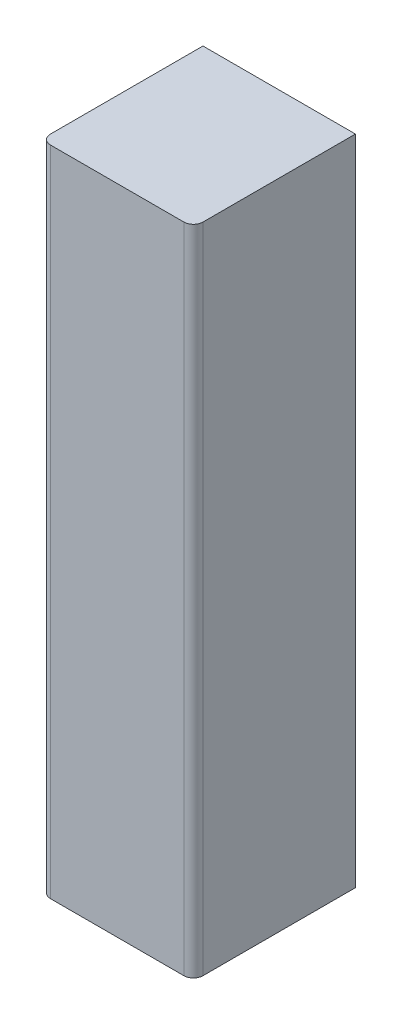
ISO-10303-21;
HEADER;
FILE_DESCRIPTION(('STEP AP214'),'2;1');
FILE_NAME('part.step','',(''),(''),'','','');
FILE_SCHEMA(('AUTOMOTIVE_DESIGN { 1 0 10303 214 1 1 1 1 }'));
ENDSEC;
DATA;
#1=APPLICATION_CONTEXT('core data for automotive mechanical design processes');
#2=APPLICATION_PROTOCOL_DEFINITION('international standard','automotive_design',2000,#1);
#3=PRODUCT_CONTEXT('',#1,'mechanical');
#4=PRODUCT('Part','Part','',(#3));
#5=PRODUCT_RELATED_PRODUCT_CATEGORY('part','',(#4));
#6=PRODUCT_DEFINITION_FORMATION('','',#4);
#7=PRODUCT_DEFINITION_CONTEXT('part definition',#1,'design');
#8=PRODUCT_DEFINITION('design','',#6,#7);
#9=PRODUCT_DEFINITION_SHAPE('','',#8);
#10=(LENGTH_UNIT() NAMED_UNIT(*) SI_UNIT(.MILLI.,.METRE.));
#11=(NAMED_UNIT(*) PLANE_ANGLE_UNIT() SI_UNIT($,.RADIAN.));
#12=(NAMED_UNIT(*) SI_UNIT($,.STERADIAN.) SOLID_ANGLE_UNIT());
#13=UNCERTAINTY_MEASURE_WITH_UNIT(LENGTH_MEASURE(1.E-05),#10,'distance_accuracy_value','');
#14=(GEOMETRIC_REPRESENTATION_CONTEXT(3) GLOBAL_UNCERTAINTY_ASSIGNED_CONTEXT((#13)) GLOBAL_UNIT_ASSIGNED_CONTEXT((#10,
#11,#12)) REPRESENTATION_CONTEXT('',''));
#15=CARTESIAN_POINT('',(0.,0.,0.));
#16=DIRECTION('',(0.,0.,1.));
#17=DIRECTION('',(1.,0.,0.));
#18=AXIS2_PLACEMENT_3D('',#15,#16,#17);
#19=CARTESIAN_POINT('',(-8.,34.25,0.1));
#20=DIRECTION('',(1.,0.,0.));
#21=DIRECTION('',(0.,1.,0.));
#22=AXIS2_PLACEMENT_3D('',#19,#20,#21);
#23=PLANE('',#22);
#24=DIRECTION('',(0.,0.,-1.));
#25=VECTOR('',#24,1.);
#26=CARTESIAN_POINT('',(-8.,-34.25,0.1));
#27=LINE('',#26,#25);
#28=CARTESIAN_POINT('',(-8.,-34.25,16.));
#29=VERTEX_POINT('',#28);
#30=CARTESIAN_POINT('',(-8.,-34.25,0.));
#31=VERTEX_POINT('',#30);
#32=EDGE_CURVE('E85',#29,#31,#27,.T.);
#33=ORIENTED_EDGE('',*,*,#32,.F.);
#34=DIRECTION('',(0.,-1.,0.));
#35=VECTOR('',#34,1.);
#36=CARTESIAN_POINT('',(-8.,34.25,16.));
#37=LINE('',#36,#35);
#38=CARTESIAN_POINT('',(-8.,34.25,16.));
#39=VERTEX_POINT('',#38);
#40=EDGE_CURVE('E56',#29,#39,#37,.F.);
#41=ORIENTED_EDGE('',*,*,#40,.T.);
#42=DIRECTION('',(0.,0.,-1.));
#43=VECTOR('',#42,1.);
#44=CARTESIAN_POINT('',(-8.,34.25,0.1));
#45=LINE('',#44,#43);
#46=CARTESIAN_POINT('',(-8.,34.25,0.));
#47=VERTEX_POINT('',#46);
#48=EDGE_CURVE('E105',#39,#47,#45,.T.);
#49=ORIENTED_EDGE('',*,*,#48,.T.);
#50=DIRECTION('',(0.,-1.,0.));
#51=VECTOR('',#50,1.);
#52=CARTESIAN_POINT('',(-8.,34.25,0.));
#53=LINE('',#52,#51);
#54=EDGE_CURVE('E101',#47,#31,#53,.T.);
#55=ORIENTED_EDGE('',*,*,#54,.T.);
#56=EDGE_LOOP('',(#33,#41,#49,#55));
#57=FACE_BOUND('',#56,.T.);
#58=ADVANCED_FACE('F33',(#57),#23,.F.);
#59=CARTESIAN_POINT('',(-8.,-34.25,0.1));
#60=DIRECTION('',(0.,1.,0.));
#61=DIRECTION('',(0.,0.,1.));
#62=AXIS2_PLACEMENT_3D('',#59,#60,#61);
#63=PLANE('',#62);
#64=DIRECTION('',(1.,0.,0.));
#65=VECTOR('',#64,1.);
#66=CARTESIAN_POINT('',(-8.,-34.25,17.));
#67=LINE('',#66,#65);
#68=CARTESIAN_POINT('',(-7.,-34.25,17.));
#69=VERTEX_POINT('',#68);
#70=CARTESIAN_POINT('',(7.00000000000002,-34.25,17.));
#71=VERTEX_POINT('',#70);
#72=EDGE_CURVE('E110',#69,#71,#67,.T.);
#73=ORIENTED_EDGE('',*,*,#72,.F.);
#74=CARTESIAN_POINT('',(-7.,-34.25,16.));
#75=DIRECTION('',(0.,1.,0.));
#76=DIRECTION('',(0.,0.,1.));
#77=AXIS2_PLACEMENT_3D('',#74,#75,#76);
#78=CIRCLE('',#77,1.);
#79=EDGE_CURVE('E92',#69,#29,#78,.F.);
#80=ORIENTED_EDGE('',*,*,#79,.T.);
#81=ORIENTED_EDGE('',*,*,#32,.T.);
#82=DIRECTION('',(1.,0.,0.));
#83=VECTOR('',#82,1.);
#84=CARTESIAN_POINT('',(-8.,-34.25,0.));
#85=LINE('',#84,#83);
#86=CARTESIAN_POINT('',(8.00000000000002,-34.25,0.));
#87=VERTEX_POINT('',#86);
#88=EDGE_CURVE('E90',#31,#87,#85,.T.);
#89=ORIENTED_EDGE('',*,*,#88,.T.);
#90=DIRECTION('',(0.,0.,-1.));
#91=VECTOR('',#90,1.);
#92=CARTESIAN_POINT('',(8.00000000000002,-34.25,0.1));
#93=LINE('',#92,#91);
#94=CARTESIAN_POINT('',(8.00000000000002,-34.25,16.));
#95=VERTEX_POINT('',#94);
#96=EDGE_CURVE('E95',#95,#87,#93,.T.);
#97=ORIENTED_EDGE('',*,*,#96,.F.);
#98=CARTESIAN_POINT('',(7.00000000000002,-34.25,16.));
#99=DIRECTION('',(0.,1.,0.));
#100=DIRECTION('',(0.,0.,1.));
#101=AXIS2_PLACEMENT_3D('',#98,#99,#100);
#102=CIRCLE('',#101,1.);
#103=EDGE_CURVE('E126',#95,#71,#102,.F.);
#104=ORIENTED_EDGE('',*,*,#103,.T.);
#105=EDGE_LOOP('',(#73,#80,#81,#89,#97,#104));
#106=FACE_BOUND('',#105,.T.);
#107=ADVANCED_FACE('F88',(#106),#63,.F.);
#108=CARTESIAN_POINT('',(8.00000000000002,-34.25,0.1));
#109=DIRECTION('',(-1.,0.,0.));
#110=DIRECTION('',(0.,-1.,0.));
#111=AXIS2_PLACEMENT_3D('',#108,#109,#110);
#112=PLANE('',#111);
#113=DIRECTION('',(0.,0.,-1.));
#114=VECTOR('',#113,1.);
#115=CARTESIAN_POINT('',(8.,34.25,0.1));
#116=LINE('',#115,#114);
#117=CARTESIAN_POINT('',(8.,34.25,16.));
#118=VERTEX_POINT('',#117);
#119=CARTESIAN_POINT('',(8.,34.25,0.));
#120=VERTEX_POINT('',#119);
#121=EDGE_CURVE('E118',#118,#120,#116,.T.);
#122=ORIENTED_EDGE('',*,*,#121,.F.);
#123=DIRECTION('',(0.,1.,0.));
#124=VECTOR('',#123,1.);
#125=CARTESIAN_POINT('',(8.00000000000002,-34.25,16.));
#126=LINE('',#125,#124);
#127=EDGE_CURVE('E11',#118,#95,#126,.F.);
#128=ORIENTED_EDGE('',*,*,#127,.T.);
#129=ORIENTED_EDGE('',*,*,#96,.T.);
#130=DIRECTION('',(0.,1.,0.));
#131=VECTOR('',#130,1.);
#132=CARTESIAN_POINT('',(8.00000000000002,-34.25,0.));
#133=LINE('',#132,#131);
#134=EDGE_CURVE('E103',#87,#120,#133,.T.);
#135=ORIENTED_EDGE('',*,*,#134,.T.);
#136=EDGE_LOOP('',(#122,#128,#129,#135));
#137=FACE_BOUND('',#136,.T.);
#138=ADVANCED_FACE('F151',(#137),#112,.F.);
#139=CARTESIAN_POINT('',(-8.,34.25,0.1));
#140=DIRECTION('',(0.,-1.,0.));
#141=DIRECTION('',(0.,0.,-1.));
#142=AXIS2_PLACEMENT_3D('',#139,#140,#141);
#143=PLANE('',#142);
#144=ORIENTED_EDGE('',*,*,#48,.F.);
#145=CARTESIAN_POINT('',(-7.,34.25,16.));
#146=DIRECTION('',(0.,-1.,0.));
#147=DIRECTION('',(0.,0.,-1.));
#148=AXIS2_PLACEMENT_3D('',#145,#146,#147);
#149=CIRCLE('',#148,1.);
#150=CARTESIAN_POINT('',(-7.,34.25,17.));
#151=VERTEX_POINT('',#150);
#152=EDGE_CURVE('E41',#39,#151,#149,.F.);
#153=ORIENTED_EDGE('',*,*,#152,.T.);
#154=DIRECTION('',(-1.,0.,0.));
#155=VECTOR('',#154,1.);
#156=CARTESIAN_POINT('',(-8.,34.25,17.));
#157=LINE('',#156,#155);
#158=CARTESIAN_POINT('',(7.,34.25,17.));
#159=VERTEX_POINT('',#158);
#160=EDGE_CURVE('E107',#159,#151,#157,.T.);
#161=ORIENTED_EDGE('',*,*,#160,.F.);
#162=CARTESIAN_POINT('',(7.,34.25,16.));
#163=DIRECTION('',(0.,-1.,0.));
#164=DIRECTION('',(0.,0.,-1.));
#165=AXIS2_PLACEMENT_3D('',#162,#163,#164);
#166=CIRCLE('',#165,1.);
#167=EDGE_CURVE('E48',#159,#118,#166,.F.);
#168=ORIENTED_EDGE('',*,*,#167,.T.);
#169=ORIENTED_EDGE('',*,*,#121,.T.);
#170=DIRECTION('',(-1.,0.,0.));
#171=VECTOR('',#170,1.);
#172=CARTESIAN_POINT('',(-8.,34.25,0.));
#173=LINE('',#172,#171);
#174=EDGE_CURVE('E115',#120,#47,#173,.T.);
#175=ORIENTED_EDGE('',*,*,#174,.T.);
#176=EDGE_LOOP('',(#144,#153,#161,#168,#169,#175));
#177=FACE_BOUND('',#176,.T.);
#178=ADVANCED_FACE('F131',(#177),#143,.F.);
#179=CARTESIAN_POINT('',(-8.,-34.25,0.));
#180=DIRECTION('',(0.,0.,1.));
#181=DIRECTION('',(1.,0.,0.));
#182=AXIS2_PLACEMENT_3D('',#179,#180,#181);
#183=PLANE('',#182);
#184=ORIENTED_EDGE('',*,*,#54,.F.);
#185=ORIENTED_EDGE('',*,*,#174,.F.);
#186=ORIENTED_EDGE('',*,*,#134,.F.);
#187=ORIENTED_EDGE('',*,*,#88,.F.);
#188=EDGE_LOOP('',(#184,#185,#186,#187));
#189=FACE_BOUND('',#188,.T.);
#190=ADVANCED_FACE('F99',(#189),#183,.F.);
#191=CARTESIAN_POINT('',(-8.,-34.25,17.));
#192=DIRECTION('',(0.,0.,1.));
#193=DIRECTION('',(1.,0.,0.));
#194=AXIS2_PLACEMENT_3D('',#191,#192,#193);
#195=PLANE('',#194);
#196=ORIENTED_EDGE('',*,*,#160,.T.);
#197=DIRECTION('',(0.,-1.,0.));
#198=VECTOR('',#197,1.);
#199=CARTESIAN_POINT('',(-7.,-34.25,17.));
#200=LINE('',#199,#198);
#201=EDGE_CURVE('E123',#151,#69,#200,.T.);
#202=ORIENTED_EDGE('',*,*,#201,.T.);
#203=ORIENTED_EDGE('',*,*,#72,.T.);
#204=DIRECTION('',(0.,1.,0.));
#205=VECTOR('',#204,1.);
#206=CARTESIAN_POINT('',(7.,34.25,17.));
#207=LINE('',#206,#205);
#208=EDGE_CURVE('E94',#71,#159,#207,.T.);
#209=ORIENTED_EDGE('',*,*,#208,.T.);
#210=EDGE_LOOP('',(#196,#202,#203,#209));
#211=FACE_BOUND('',#210,.T.);
#212=ADVANCED_FACE('F135',(#211),#195,.T.);
#213=CARTESIAN_POINT('',(-7.,-34.25,16.));
#214=DIRECTION('',(0.,1.,0.));
#215=DIRECTION('',(-1.,0.,0.));
#216=AXIS2_PLACEMENT_3D('',#213,#214,#215);
#217=CYLINDRICAL_SURFACE('',#216,1.);
#218=ORIENTED_EDGE('',*,*,#152,.F.);
#219=ORIENTED_EDGE('',*,*,#40,.F.);
#220=ORIENTED_EDGE('',*,*,#79,.F.);
#221=ORIENTED_EDGE('',*,*,#201,.F.);
#222=EDGE_LOOP('',(#218,#219,#220,#221));
#223=FACE_BOUND('',#222,.T.);
#224=ADVANCED_FACE('F138',(#223),#217,.T.);
#225=CARTESIAN_POINT('',(7.00000000000002,-34.25,16.));
#226=DIRECTION('',(0.,-1.,0.));
#227=DIRECTION('',(1.,0.,0.));
#228=AXIS2_PLACEMENT_3D('',#225,#226,#227);
#229=CYLINDRICAL_SURFACE('',#228,1.);
#230=ORIENTED_EDGE('',*,*,#103,.F.);
#231=ORIENTED_EDGE('',*,*,#127,.F.);
#232=ORIENTED_EDGE('',*,*,#167,.F.);
#233=ORIENTED_EDGE('',*,*,#208,.F.);
#234=EDGE_LOOP('',(#230,#231,#232,#233));
#235=FACE_BOUND('',#234,.T.);
#236=ADVANCED_FACE('F35',(#235),#229,.T.);
#237=CLOSED_SHELL('',(#58,#107,#138,#178,#190,#212,#224,#236));
#238=MANIFOLD_SOLID_BREP('B2',#237);
#239=ADVANCED_BREP_SHAPE_REPRESENTATION('',(#18,#238),#14);
#240=SHAPE_DEFINITION_REPRESENTATION(#9,#239);
ENDSEC;
END-ISO-10303-21;
